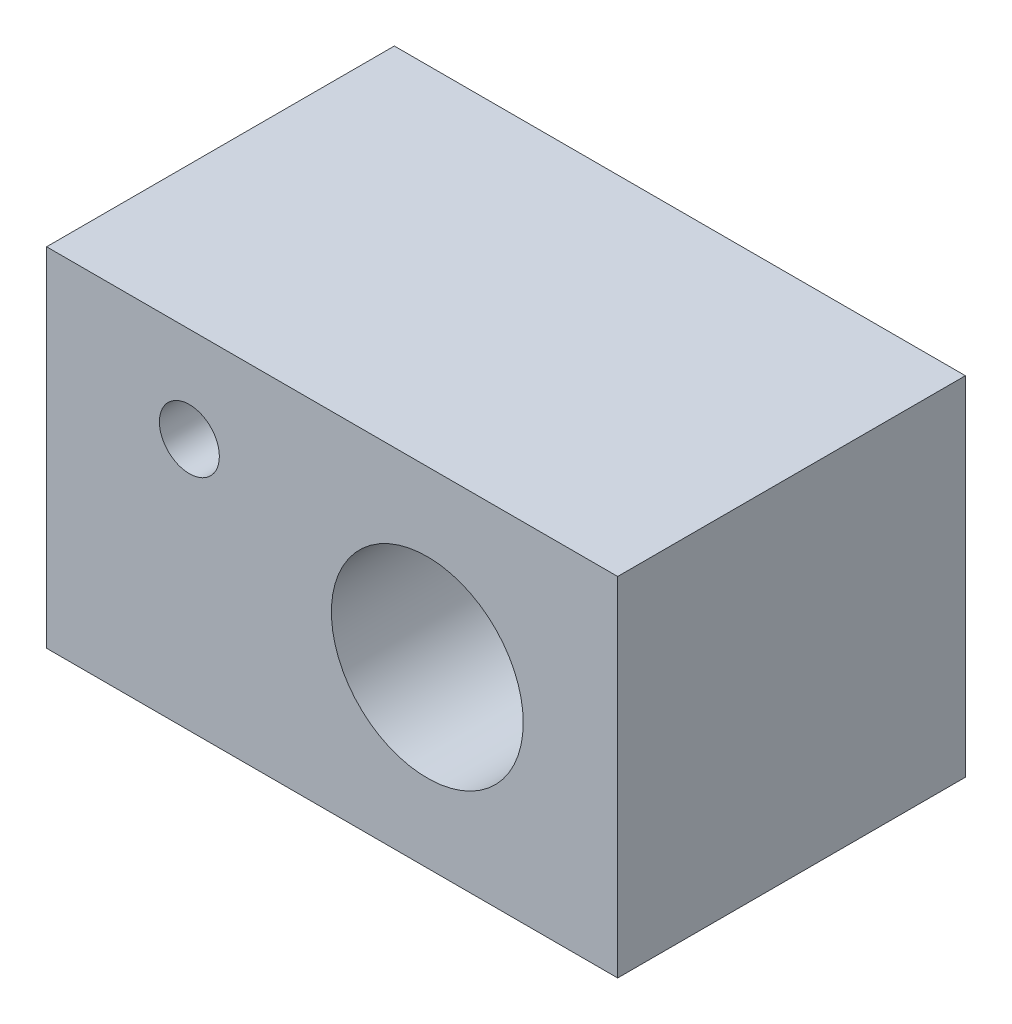
ISO-10303-21;
HEADER;
FILE_DESCRIPTION(('STEP AP214'),'2;1');
FILE_NAME('part.step','',(''),(''),'','','');
FILE_SCHEMA(('AUTOMOTIVE_DESIGN { 1 0 10303 214 1 1 1 1 }'));
ENDSEC;
DATA;
#1=APPLICATION_CONTEXT('core data for automotive mechanical design processes');
#2=APPLICATION_PROTOCOL_DEFINITION('international standard','automotive_design',2000,#1);
#3=PRODUCT_CONTEXT('',#1,'mechanical');
#4=PRODUCT('Part','Part','',(#3));
#5=PRODUCT_RELATED_PRODUCT_CATEGORY('part','',(#4));
#6=PRODUCT_DEFINITION_FORMATION('','',#4);
#7=PRODUCT_DEFINITION_CONTEXT('part definition',#1,'design');
#8=PRODUCT_DEFINITION('design','',#6,#7);
#9=PRODUCT_DEFINITION_SHAPE('','',#8);
#10=(LENGTH_UNIT() NAMED_UNIT(*) SI_UNIT(.MILLI.,.METRE.));
#11=(NAMED_UNIT(*) PLANE_ANGLE_UNIT() SI_UNIT($,.RADIAN.));
#12=(NAMED_UNIT(*) SI_UNIT($,.STERADIAN.) SOLID_ANGLE_UNIT());
#13=UNCERTAINTY_MEASURE_WITH_UNIT(LENGTH_MEASURE(1.E-05),#10,'distance_accuracy_value','');
#14=(GEOMETRIC_REPRESENTATION_CONTEXT(3) GLOBAL_UNCERTAINTY_ASSIGNED_CONTEXT((#13)) GLOBAL_UNIT_ASSIGNED_CONTEXT((#10,
#11,#12)) REPRESENTATION_CONTEXT('',''));
#15=CARTESIAN_POINT('',(0.,0.,0.));
#16=DIRECTION('',(0.,0.,1.));
#17=DIRECTION('',(1.,0.,0.));
#18=AXIS2_PLACEMENT_3D('',#15,#16,#17);
#19=CARTESIAN_POINT('',(0.,5.8,5.8));
#20=DIRECTION('',(0.,0.,-1.));
#21=DIRECTION('',(-1.,0.,0.));
#22=AXIS2_PLACEMENT_3D('',#19,#20,#21);
#23=PLANE('',#22);
#24=CARTESIAN_POINT('',(2.38125,4.2125,5.8));
#25=DIRECTION('',(0.,0.,1.));
#26=DIRECTION('',(1.,0.,0.));
#27=AXIS2_PLACEMENT_3D('',#24,#25,#26);
#28=CIRCLE('',#27,0.5);
#29=CARTESIAN_POINT('',(2.88125,4.2125,5.8));
#30=VERTEX_POINT('',#29);
#31=EDGE_CURVE('E116',#30,#30,#28,.T.);
#32=ORIENTED_EDGE('',*,*,#31,.F.);
#33=EDGE_LOOP('',(#32));
#34=FACE_BOUND('',#33,.T.);
#35=DIRECTION('',(0.,-1.,0.));
#36=VECTOR('',#35,1.);
#37=CARTESIAN_POINT('',(0.,0.,5.8));
#38=LINE('',#37,#36);
#39=CARTESIAN_POINT('',(0.,5.8,5.8));
#40=VERTEX_POINT('',#39);
#41=CARTESIAN_POINT('',(0.,0.,5.8));
#42=VERTEX_POINT('',#41);
#43=EDGE_CURVE('E86',#40,#42,#38,.T.);
#44=ORIENTED_EDGE('',*,*,#43,.T.);
#45=DIRECTION('',(1.,0.,0.));
#46=VECTOR('',#45,1.);
#47=CARTESIAN_POINT('',(0.,0.,5.8));
#48=LINE('',#47,#46);
#49=CARTESIAN_POINT('',(9.525,0.,5.8));
#50=VERTEX_POINT('',#49);
#51=EDGE_CURVE('E81',#42,#50,#48,.T.);
#52=ORIENTED_EDGE('',*,*,#51,.T.);
#53=DIRECTION('',(0.,1.,0.));
#54=VECTOR('',#53,1.);
#55=CARTESIAN_POINT('',(9.525,0.,5.8));
#56=LINE('',#55,#54);
#57=CARTESIAN_POINT('',(9.525,5.8,5.8));
#58=VERTEX_POINT('',#57);
#59=EDGE_CURVE('E84',#50,#58,#56,.T.);
#60=ORIENTED_EDGE('',*,*,#59,.T.);
#61=DIRECTION('',(-1.,0.,0.));
#62=VECTOR('',#61,1.);
#63=CARTESIAN_POINT('',(0.,5.8,5.8));
#64=LINE('',#63,#62);
#65=EDGE_CURVE('E51',#58,#40,#64,.T.);
#66=ORIENTED_EDGE('',*,*,#65,.T.);
#67=EDGE_LOOP('',(#44,#52,#60,#66));
#68=FACE_BOUND('',#67,.T.);
#69=CARTESIAN_POINT('',(6.35,2.9,5.8));
#70=DIRECTION('',(0.,0.,1.));
#71=DIRECTION('',(1.,0.,0.));
#72=AXIS2_PLACEMENT_3D('',#69,#70,#71);
#73=CIRCLE('',#72,1.6);
#74=CARTESIAN_POINT('',(7.95,2.9,5.8));
#75=VERTEX_POINT('',#74);
#76=EDGE_CURVE('E112',#75,#75,#73,.T.);
#77=ORIENTED_EDGE('',*,*,#76,.F.);
#78=EDGE_LOOP('',(#77));
#79=FACE_BOUND('',#78,.T.);
#80=ADVANCED_FACE('F33',(#34,#68,#79),#23,.F.);
#81=CARTESIAN_POINT('',(0.,0.,5.8));
#82=DIRECTION('',(1.,0.,0.));
#83=DIRECTION('',(0.,0.,-1.));
#84=AXIS2_PLACEMENT_3D('',#81,#82,#83);
#85=PLANE('',#84);
#86=DIRECTION('',(0.,-1.,0.));
#87=VECTOR('',#86,1.);
#88=CARTESIAN_POINT('',(0.,0.,0.));
#89=LINE('',#88,#87);
#90=CARTESIAN_POINT('',(0.,5.8,0.));
#91=VERTEX_POINT('',#90);
#92=CARTESIAN_POINT('',(0.,0.,0.));
#93=VERTEX_POINT('',#92);
#94=EDGE_CURVE('E99',#91,#93,#89,.T.);
#95=ORIENTED_EDGE('',*,*,#94,.T.);
#96=DIRECTION('',(0.,0.,-1.));
#97=VECTOR('',#96,1.);
#98=CARTESIAN_POINT('',(0.,0.,5.8));
#99=LINE('',#98,#97);
#100=EDGE_CURVE('E11',#42,#93,#99,.T.);
#101=ORIENTED_EDGE('',*,*,#100,.F.);
#102=ORIENTED_EDGE('',*,*,#43,.F.);
#103=DIRECTION('',(0.,0.,-1.));
#104=VECTOR('',#103,1.);
#105=CARTESIAN_POINT('',(0.,5.8,5.8));
#106=LINE('',#105,#104);
#107=EDGE_CURVE('E95',#40,#91,#106,.T.);
#108=ORIENTED_EDGE('',*,*,#107,.T.);
#109=EDGE_LOOP('',(#95,#101,#102,#108));
#110=FACE_BOUND('',#109,.T.);
#111=ADVANCED_FACE('F35',(#110),#85,.F.);
#112=CARTESIAN_POINT('',(0.,0.,5.8));
#113=DIRECTION('',(0.,1.,0.));
#114=DIRECTION('',(0.,0.,1.));
#115=AXIS2_PLACEMENT_3D('',#112,#113,#114);
#116=PLANE('',#115);
#117=DIRECTION('',(1.,0.,0.));
#118=VECTOR('',#117,1.);
#119=CARTESIAN_POINT('',(0.,0.,0.));
#120=LINE('',#119,#118);
#121=CARTESIAN_POINT('',(9.525,0.,0.));
#122=VERTEX_POINT('',#121);
#123=EDGE_CURVE('E90',#93,#122,#120,.T.);
#124=ORIENTED_EDGE('',*,*,#123,.T.);
#125=DIRECTION('',(0.,0.,-1.));
#126=VECTOR('',#125,1.);
#127=CARTESIAN_POINT('',(9.525,0.,5.8));
#128=LINE('',#127,#126);
#129=EDGE_CURVE('E43',#50,#122,#128,.T.);
#130=ORIENTED_EDGE('',*,*,#129,.F.);
#131=ORIENTED_EDGE('',*,*,#51,.F.);
#132=ORIENTED_EDGE('',*,*,#100,.T.);
#133=EDGE_LOOP('',(#124,#130,#131,#132));
#134=FACE_BOUND('',#133,.T.);
#135=ADVANCED_FACE('F89',(#134),#116,.F.);
#136=CARTESIAN_POINT('',(9.525,0.,5.8));
#137=DIRECTION('',(-1.,0.,0.));
#138=DIRECTION('',(0.,-1.,0.));
#139=AXIS2_PLACEMENT_3D('',#136,#137,#138);
#140=PLANE('',#139);
#141=DIRECTION('',(0.,1.,0.));
#142=VECTOR('',#141,1.);
#143=CARTESIAN_POINT('',(9.525,0.,0.));
#144=LINE('',#143,#142);
#145=CARTESIAN_POINT('',(9.525,5.8,0.));
#146=VERTEX_POINT('',#145);
#147=EDGE_CURVE('E68',#122,#146,#144,.T.);
#148=ORIENTED_EDGE('',*,*,#147,.T.);
#149=DIRECTION('',(0.,0.,-1.));
#150=VECTOR('',#149,1.);
#151=CARTESIAN_POINT('',(9.525,5.8,5.8));
#152=LINE('',#151,#150);
#153=EDGE_CURVE('E91',#58,#146,#152,.T.);
#154=ORIENTED_EDGE('',*,*,#153,.F.);
#155=ORIENTED_EDGE('',*,*,#59,.F.);
#156=ORIENTED_EDGE('',*,*,#129,.T.);
#157=EDGE_LOOP('',(#148,#154,#155,#156));
#158=FACE_BOUND('',#157,.T.);
#159=ADVANCED_FACE('F93',(#158),#140,.F.);
#160=CARTESIAN_POINT('',(0.,5.8,5.8));
#161=DIRECTION('',(0.,-1.,0.));
#162=DIRECTION('',(0.,0.,-1.));
#163=AXIS2_PLACEMENT_3D('',#160,#161,#162);
#164=PLANE('',#163);
#165=DIRECTION('',(-1.,0.,0.));
#166=VECTOR('',#165,1.);
#167=CARTESIAN_POINT('',(0.,5.8,0.));
#168=LINE('',#167,#166);
#169=EDGE_CURVE('E74',#146,#91,#168,.T.);
#170=ORIENTED_EDGE('',*,*,#169,.T.);
#171=ORIENTED_EDGE('',*,*,#107,.F.);
#172=ORIENTED_EDGE('',*,*,#65,.F.);
#173=ORIENTED_EDGE('',*,*,#153,.T.);
#174=EDGE_LOOP('',(#170,#171,#172,#173));
#175=FACE_BOUND('',#174,.T.);
#176=ADVANCED_FACE('F106',(#175),#164,.F.);
#177=CARTESIAN_POINT('',(0.,5.8,0.));
#178=DIRECTION('',(0.,0.,-1.));
#179=DIRECTION('',(-1.,0.,0.));
#180=AXIS2_PLACEMENT_3D('',#177,#178,#179);
#181=PLANE('',#180);
#182=CARTESIAN_POINT('',(2.38125,4.2125,0.));
#183=DIRECTION('',(0.,0.,1.));
#184=DIRECTION('',(1.,0.,0.));
#185=AXIS2_PLACEMENT_3D('',#182,#183,#184);
#186=CIRCLE('',#185,0.5);
#187=CARTESIAN_POINT('',(2.88125,4.2125,0.));
#188=VERTEX_POINT('',#187);
#189=EDGE_CURVE('E115',#188,#188,#186,.T.);
#190=ORIENTED_EDGE('',*,*,#189,.T.);
#191=EDGE_LOOP('',(#190));
#192=FACE_BOUND('',#191,.T.);
#193=CARTESIAN_POINT('',(6.35,2.9,0.));
#194=DIRECTION('',(0.,0.,-1.));
#195=DIRECTION('',(-1.,0.,0.));
#196=AXIS2_PLACEMENT_3D('',#193,#194,#195);
#197=CIRCLE('',#196,1.6);
#198=CARTESIAN_POINT('',(4.75,2.9,0.));
#199=VERTEX_POINT('',#198);
#200=EDGE_CURVE('E37',#199,#199,#197,.T.);
#201=ORIENTED_EDGE('',*,*,#200,.F.);
#202=EDGE_LOOP('',(#201));
#203=FACE_BOUND('',#202,.T.);
#204=ORIENTED_EDGE('',*,*,#94,.F.);
#205=ORIENTED_EDGE('',*,*,#169,.F.);
#206=ORIENTED_EDGE('',*,*,#147,.F.);
#207=ORIENTED_EDGE('',*,*,#123,.F.);
#208=EDGE_LOOP('',(#204,#205,#206,#207));
#209=FACE_BOUND('',#208,.T.);
#210=ADVANCED_FACE('F109',(#192,#203,#209),#181,.T.);
#211=CARTESIAN_POINT('',(6.35,2.9,5.8));
#212=DIRECTION('',(0.,0.,1.));
#213=DIRECTION('',(1.,0.,0.));
#214=AXIS2_PLACEMENT_3D('',#211,#212,#213);
#215=CYLINDRICAL_SURFACE('',#214,1.6);
#216=ORIENTED_EDGE('',*,*,#200,.T.);
#217=EDGE_LOOP('',(#216));
#218=FACE_BOUND('',#217,.T.);
#219=ORIENTED_EDGE('',*,*,#76,.T.);
#220=EDGE_LOOP('',(#219));
#221=FACE_BOUND('',#220,.T.);
#222=ADVANCED_FACE('F127',(#218,#221),#215,.F.);
#223=CARTESIAN_POINT('',(2.38125,4.2125,0.));
#224=DIRECTION('',(0.,0.,1.));
#225=DIRECTION('',(1.,0.,0.));
#226=AXIS2_PLACEMENT_3D('',#223,#224,#225);
#227=CYLINDRICAL_SURFACE('',#226,0.5);
#228=ORIENTED_EDGE('',*,*,#189,.F.);
#229=EDGE_LOOP('',(#228));
#230=FACE_BOUND('',#229,.T.);
#231=ORIENTED_EDGE('',*,*,#31,.T.);
#232=EDGE_LOOP('',(#231));
#233=FACE_BOUND('',#232,.T.);
#234=ADVANCED_FACE('F124',(#230,#233),#227,.F.);
#235=CLOSED_SHELL('',(#80,#111,#135,#159,#176,#210,#222,#234));
#236=MANIFOLD_SOLID_BREP('B2',#235);
#237=ADVANCED_BREP_SHAPE_REPRESENTATION('',(#18,#236),#14);
#238=SHAPE_DEFINITION_REPRESENTATION(#9,#237);
ENDSEC;
END-ISO-10303-21;
